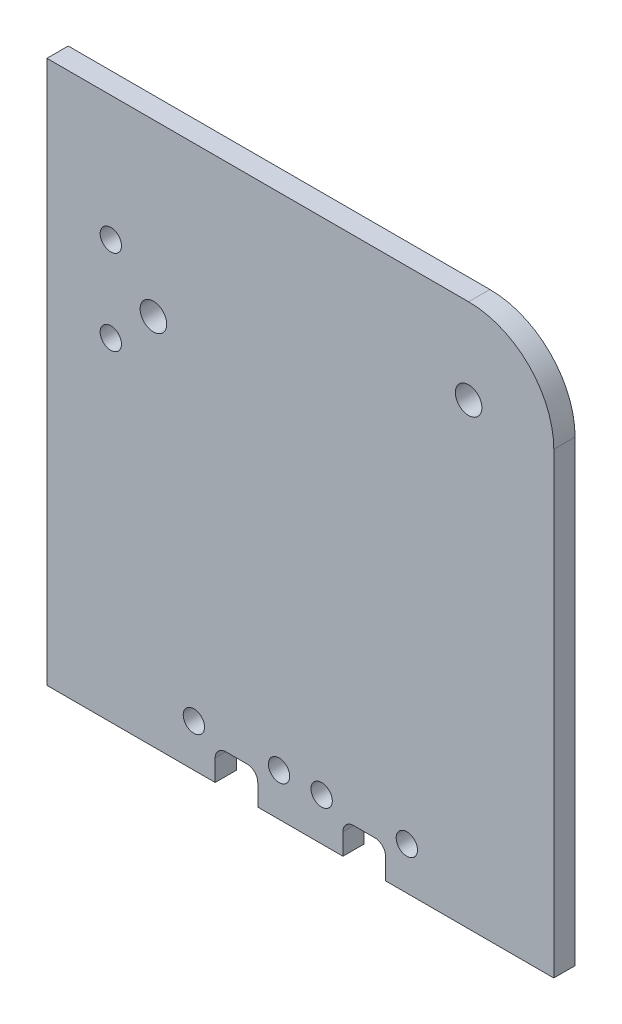
ISO-10303-21;
HEADER;
FILE_DESCRIPTION(('STEP AP214'),'2;1');
FILE_NAME('part.step','',(''),(''),'','','');
FILE_SCHEMA(('AUTOMOTIVE_DESIGN { 1 0 10303 214 1 1 1 1 }'));
ENDSEC;
DATA;
#1=APPLICATION_CONTEXT('core data for automotive mechanical design processes');
#2=APPLICATION_PROTOCOL_DEFINITION('international standard','automotive_design',2000,#1);
#3=PRODUCT_CONTEXT('',#1,'mechanical');
#4=PRODUCT('Part','Part','',(#3));
#5=PRODUCT_RELATED_PRODUCT_CATEGORY('part','',(#4));
#6=PRODUCT_DEFINITION_FORMATION('','',#4);
#7=PRODUCT_DEFINITION_CONTEXT('part definition',#1,'design');
#8=PRODUCT_DEFINITION('design','',#6,#7);
#9=PRODUCT_DEFINITION_SHAPE('','',#8);
#10=(LENGTH_UNIT() NAMED_UNIT(*) SI_UNIT(.MILLI.,.METRE.));
#11=(NAMED_UNIT(*) PLANE_ANGLE_UNIT() SI_UNIT($,.RADIAN.));
#12=(NAMED_UNIT(*) SI_UNIT($,.STERADIAN.) SOLID_ANGLE_UNIT());
#13=UNCERTAINTY_MEASURE_WITH_UNIT(LENGTH_MEASURE(1.E-05),#10,'distance_accuracy_value','');
#14=(GEOMETRIC_REPRESENTATION_CONTEXT(3) GLOBAL_UNCERTAINTY_ASSIGNED_CONTEXT((#13)) GLOBAL_UNIT_ASSIGNED_CONTEXT((#10,
#11,#12)) REPRESENTATION_CONTEXT('',''));
#15=CARTESIAN_POINT('',(0.,0.,0.));
#16=DIRECTION('',(0.,0.,1.));
#17=DIRECTION('',(1.,0.,0.));
#18=AXIS2_PLACEMENT_3D('',#15,#16,#17);
#19=CARTESIAN_POINT('',(11.0580949327945,-12.617994100295,2.));
#20=DIRECTION('',(0.,0.,1.));
#21=DIRECTION('',(1.,0.,0.));
#22=AXIS2_PLACEMENT_3D('',#19,#20,#21);
#23=PLANE('',#22);
#24=CARTESIAN_POINT('',(-2.74190506720548,-51.617994100295,2.));
#25=DIRECTION('',(0.,0.,1.));
#26=DIRECTION('',(1.,0.,0.));
#27=AXIS2_PLACEMENT_3D('',#24,#25,#26);
#28=CIRCLE('',#27,1.);
#29=CARTESIAN_POINT('',(-1.74190506720547,-51.617994100295,2.));
#30=VERTEX_POINT('',#29);
#31=EDGE_CURVE('E371',#30,#30,#28,.T.);
#32=ORIENTED_EDGE('',*,*,#31,.F.);
#33=EDGE_LOOP('',(#32));
#34=FACE_BOUND('',#33,.T.);
#35=CARTESIAN_POINT('',(-14.7419050672055,-51.617994100295,2.));
#36=DIRECTION('',(0.,0.,1.));
#37=DIRECTION('',(1.,0.,0.));
#38=AXIS2_PLACEMENT_3D('',#35,#36,#37);
#39=CIRCLE('',#38,1.);
#40=CARTESIAN_POINT('',(-13.7419050672055,-51.617994100295,2.));
#41=VERTEX_POINT('',#40);
#42=EDGE_CURVE('E383',#41,#41,#39,.T.);
#43=ORIENTED_EDGE('',*,*,#42,.F.);
#44=EDGE_LOOP('',(#43));
#45=FACE_BOUND('',#44,.T.);
#46=CARTESIAN_POINT('',(-22.5419050672055,-16.367994100295,2.));
#47=DIRECTION('',(0.,0.,1.));
#48=DIRECTION('',(1.,0.,0.));
#49=AXIS2_PLACEMENT_3D('',#46,#47,#48);
#50=CIRCLE('',#49,1.);
#51=CARTESIAN_POINT('',(-21.5419050672055,-16.367994100295,2.));
#52=VERTEX_POINT('',#51);
#53=EDGE_CURVE('E395',#52,#52,#50,.T.);
#54=ORIENTED_EDGE('',*,*,#53,.F.);
#55=EDGE_LOOP('',(#54));
#56=FACE_BOUND('',#55,.T.);
#57=CARTESIAN_POINT('',(11.0580949327945,-12.617994100295,2.));
#58=DIRECTION('',(0.,0.,1.));
#59=DIRECTION('',(1.,0.,0.));
#60=AXIS2_PLACEMENT_3D('',#57,#58,#59);
#61=CIRCLE('',#60,1.25);
#62=CARTESIAN_POINT('',(12.3080949327945,-12.617994100295,2.));
#63=VERTEX_POINT('',#62);
#64=EDGE_CURVE('E187',#63,#63,#61,.T.);
#65=ORIENTED_EDGE('',*,*,#64,.F.);
#66=EDGE_LOOP('',(#65));
#67=FACE_BOUND('',#66,.T.);
#68=DIRECTION('',(1.,0.,0.));
#69=VECTOR('',#68,1.);
#70=CARTESIAN_POINT('',(3.25809493279453,-55.617994100295,2.));
#71=LINE('',#70,#69);
#72=CARTESIAN_POINT('',(3.25809493279453,-55.617994100295,2.));
#73=VERTEX_POINT('',#72);
#74=CARTESIAN_POINT('',(19.0580949327945,-55.617994100295,2.));
#75=VERTEX_POINT('',#74);
#76=EDGE_CURVE('E218',#73,#75,#71,.T.);
#77=ORIENTED_EDGE('',*,*,#76,.T.);
#78=DIRECTION('',(0.,1.,0.));
#79=VECTOR('',#78,1.);
#80=CARTESIAN_POINT('',(19.0580949327945,-53.900810771949,2.));
#81=LINE('',#80,#79);
#82=CARTESIAN_POINT('',(19.0580949327945,-12.617994100295,2.));
#83=VERTEX_POINT('',#82);
#84=EDGE_CURVE('E119',#75,#83,#81,.T.);
#85=ORIENTED_EDGE('',*,*,#84,.T.);
#86=CARTESIAN_POINT('',(11.0580949327945,-12.617994100295,2.));
#87=DIRECTION('',(0.,0.,1.));
#88=DIRECTION('',(1.,0.,0.));
#89=AXIS2_PLACEMENT_3D('',#86,#87,#88);
#90=CIRCLE('',#89,8.);
#91=CARTESIAN_POINT('',(11.0580949327945,-4.61799410029498,2.));
#92=VERTEX_POINT('',#91);
#93=EDGE_CURVE('E260',#83,#92,#90,.T.);
#94=ORIENTED_EDGE('',*,*,#93,.T.);
#95=DIRECTION('',(-1.,0.,0.));
#96=VECTOR('',#95,1.);
#97=CARTESIAN_POINT('',(-27.5419050672055,-4.61799410029498,2.));
#98=LINE('',#97,#96);
#99=CARTESIAN_POINT('',(-28.5419050672055,-4.61799410029498,2.));
#100=VERTEX_POINT('',#99);
#101=EDGE_CURVE('E277',#92,#100,#98,.T.);
#102=ORIENTED_EDGE('',*,*,#101,.T.);
#103=DIRECTION('',(0.,-1.,0.));
#104=VECTOR('',#103,1.);
#105=CARTESIAN_POINT('',(-28.5419050672055,-4.61799410029498,2.));
#106=LINE('',#105,#104);
#107=CARTESIAN_POINT('',(-28.5419050672055,-55.617994100295,2.));
#108=VERTEX_POINT('',#107);
#109=EDGE_CURVE('E274',#100,#108,#106,.T.);
#110=ORIENTED_EDGE('',*,*,#109,.T.);
#111=DIRECTION('',(1.,0.,0.));
#112=VECTOR('',#111,1.);
#113=CARTESIAN_POINT('',(-28.5419050672055,-55.617994100295,2.));
#114=LINE('',#113,#112);
#115=CARTESIAN_POINT('',(-12.7419050672055,-55.617994100295,2.));
#116=VERTEX_POINT('',#115);
#117=EDGE_CURVE('E276',#108,#116,#114,.T.);
#118=ORIENTED_EDGE('',*,*,#117,.T.);
#119=DIRECTION('',(0.,1.,0.));
#120=VECTOR('',#119,1.);
#121=CARTESIAN_POINT('',(-12.7419050672055,-53.617994100295,2.));
#122=LINE('',#121,#120);
#123=CARTESIAN_POINT('',(-12.7419050672055,-53.617994100295,2.));
#124=VERTEX_POINT('',#123);
#125=EDGE_CURVE('E279',#116,#124,#122,.T.);
#126=ORIENTED_EDGE('',*,*,#125,.T.);
#127=CARTESIAN_POINT('',(-11.7419050672055,-53.617994100295,2.));
#128=DIRECTION('',(0.,0.,-1.));
#129=DIRECTION('',(-1.,0.,0.));
#130=AXIS2_PLACEMENT_3D('',#127,#128,#129);
#131=CIRCLE('',#130,1.);
#132=CARTESIAN_POINT('',(-11.7419050672055,-52.617994100295,2.));
#133=VERTEX_POINT('',#132);
#134=EDGE_CURVE('E285',#124,#133,#131,.T.);
#135=ORIENTED_EDGE('',*,*,#134,.T.);
#136=DIRECTION('',(1.,0.,0.));
#137=VECTOR('',#136,1.);
#138=CARTESIAN_POINT('',(-11.7419050672055,-52.617994100295,2.));
#139=LINE('',#138,#137);
#140=CARTESIAN_POINT('',(-9.74190506720548,-52.617994100295,2.));
#141=VERTEX_POINT('',#140);
#142=EDGE_CURVE('E287',#133,#141,#139,.T.);
#143=ORIENTED_EDGE('',*,*,#142,.T.);
#144=CARTESIAN_POINT('',(-9.74190506720548,-53.617994100295,2.));
#145=DIRECTION('',(0.,0.,-1.));
#146=DIRECTION('',(-1.,0.,0.));
#147=AXIS2_PLACEMENT_3D('',#144,#145,#146);
#148=CIRCLE('',#147,1.);
#149=CARTESIAN_POINT('',(-8.74190506720548,-53.617994100295,2.));
#150=VERTEX_POINT('',#149);
#151=EDGE_CURVE('E289',#141,#150,#148,.T.);
#152=ORIENTED_EDGE('',*,*,#151,.T.);
#153=DIRECTION('',(0.,-1.,0.));
#154=VECTOR('',#153,1.);
#155=CARTESIAN_POINT('',(-8.74190506720548,-53.617994100295,2.));
#156=LINE('',#155,#154);
#157=CARTESIAN_POINT('',(-8.74190506720548,-55.617994100295,2.));
#158=VERTEX_POINT('',#157);
#159=EDGE_CURVE('E291',#150,#158,#156,.T.);
#160=ORIENTED_EDGE('',*,*,#159,.T.);
#161=DIRECTION('',(1.,0.,0.));
#162=VECTOR('',#161,1.);
#163=CARTESIAN_POINT('',(-8.74190506720548,-55.617994100295,2.));
#164=LINE('',#163,#162);
#165=CARTESIAN_POINT('',(-0.741905067205475,-55.617994100295,2.));
#166=VERTEX_POINT('',#165);
#167=EDGE_CURVE('E293',#158,#166,#164,.T.);
#168=ORIENTED_EDGE('',*,*,#167,.T.);
#169=DIRECTION('',(0.,1.,0.));
#170=VECTOR('',#169,1.);
#171=CARTESIAN_POINT('',(-0.741905067205475,-53.617994100295,2.));
#172=LINE('',#171,#170);
#173=CARTESIAN_POINT('',(-0.741905067205475,-53.617994100295,2.));
#174=VERTEX_POINT('',#173);
#175=EDGE_CURVE('E295',#166,#174,#172,.T.);
#176=ORIENTED_EDGE('',*,*,#175,.T.);
#177=CARTESIAN_POINT('',(0.258094932794526,-53.617994100295,2.));
#178=DIRECTION('',(0.,0.,-1.));
#179=DIRECTION('',(-1.,0.,0.));
#180=AXIS2_PLACEMENT_3D('',#177,#178,#179);
#181=CIRCLE('',#180,1.);
#182=CARTESIAN_POINT('',(0.258094932794526,-52.617994100295,2.));
#183=VERTEX_POINT('',#182);
#184=EDGE_CURVE('E165',#174,#183,#181,.T.);
#185=ORIENTED_EDGE('',*,*,#184,.T.);
#186=DIRECTION('',(1.,0.,0.));
#187=VECTOR('',#186,1.);
#188=CARTESIAN_POINT('',(0.258094932794526,-52.617994100295,2.));
#189=LINE('',#188,#187);
#190=CARTESIAN_POINT('',(2.25809493279452,-52.617994100295,2.));
#191=VERTEX_POINT('',#190);
#192=EDGE_CURVE('E159',#183,#191,#189,.T.);
#193=ORIENTED_EDGE('',*,*,#192,.T.);
#194=CARTESIAN_POINT('',(2.25809493279452,-53.617994100295,2.));
#195=DIRECTION('',(0.,0.,-1.));
#196=DIRECTION('',(-1.,0.,0.));
#197=AXIS2_PLACEMENT_3D('',#194,#195,#196);
#198=CIRCLE('',#197,1.);
#199=CARTESIAN_POINT('',(3.25809493279453,-53.617994100295,2.));
#200=VERTEX_POINT('',#199);
#201=EDGE_CURVE('E163',#191,#200,#198,.T.);
#202=ORIENTED_EDGE('',*,*,#201,.T.);
#203=DIRECTION('',(0.,-1.,0.));
#204=VECTOR('',#203,1.);
#205=CARTESIAN_POINT('',(3.25809493279453,-53.617994100295,2.));
#206=LINE('',#205,#204);
#207=EDGE_CURVE('E49',#200,#73,#206,.T.);
#208=ORIENTED_EDGE('',*,*,#207,.T.);
#209=EDGE_LOOP('',(#77,#85,#94,#102,#110,#118,#126,#135,#143,#152,#160,#168,#176,#185,#193,#202,#208));
#210=FACE_BOUND('',#209,.T.);
#211=CARTESIAN_POINT('',(-18.5419050672055,-20.617994100295,2.));
#212=DIRECTION('',(0.,0.,1.));
#213=DIRECTION('',(1.,0.,0.));
#214=AXIS2_PLACEMENT_3D('',#211,#212,#213);
#215=CIRCLE('',#214,1.25);
#216=CARTESIAN_POINT('',(-17.2919050672055,-20.617994100295,2.));
#217=VERTEX_POINT('',#216);
#218=EDGE_CURVE('E401',#217,#217,#215,.T.);
#219=ORIENTED_EDGE('',*,*,#218,.F.);
#220=EDGE_LOOP('',(#219));
#221=FACE_BOUND('',#220,.T.);
#222=CARTESIAN_POINT('',(-22.5419050672055,-24.367994100295,2.));
#223=DIRECTION('',(0.,0.,1.));
#224=DIRECTION('',(1.,0.,0.));
#225=AXIS2_PLACEMENT_3D('',#222,#223,#224);
#226=CIRCLE('',#225,1.);
#227=CARTESIAN_POINT('',(-21.5419050672055,-24.367994100295,2.));
#228=VERTEX_POINT('',#227);
#229=EDGE_CURVE('E389',#228,#228,#226,.T.);
#230=ORIENTED_EDGE('',*,*,#229,.F.);
#231=EDGE_LOOP('',(#230));
#232=FACE_BOUND('',#231,.T.);
#233=CARTESIAN_POINT('',(-6.74190506720547,-51.617994100295,2.));
#234=DIRECTION('',(0.,0.,1.));
#235=DIRECTION('',(1.,0.,0.));
#236=AXIS2_PLACEMENT_3D('',#233,#234,#235);
#237=CIRCLE('',#236,1.);
#238=CARTESIAN_POINT('',(-5.74190506720547,-51.617994100295,2.));
#239=VERTEX_POINT('',#238);
#240=EDGE_CURVE('E377',#239,#239,#237,.T.);
#241=ORIENTED_EDGE('',*,*,#240,.F.);
#242=EDGE_LOOP('',(#241));
#243=FACE_BOUND('',#242,.T.);
#244=CARTESIAN_POINT('',(5.25809493279453,-51.617994100295,2.));
#245=DIRECTION('',(0.,0.,1.));
#246=DIRECTION('',(1.,0.,0.));
#247=AXIS2_PLACEMENT_3D('',#244,#245,#246);
#248=CIRCLE('',#247,1.);
#249=CARTESIAN_POINT('',(6.25809493279453,-51.617994100295,2.));
#250=VERTEX_POINT('',#249);
#251=EDGE_CURVE('E362',#250,#250,#248,.T.);
#252=ORIENTED_EDGE('',*,*,#251,.F.);
#253=EDGE_LOOP('',(#252));
#254=FACE_BOUND('',#253,.T.);
#255=ADVANCED_FACE('F32',(#34,#45,#56,#67,#210,#221,#232,#243,#254),#23,.T.);
#256=CARTESIAN_POINT('',(11.0580949327945,-12.617994100295,0.));
#257=DIRECTION('',(0.,0.,1.));
#258=DIRECTION('',(1.,0.,0.));
#259=AXIS2_PLACEMENT_3D('',#256,#257,#258);
#260=PLANE('',#259);
#261=DIRECTION('',(1.,0.,0.));
#262=VECTOR('',#261,1.);
#263=CARTESIAN_POINT('',(3.25809493279453,-55.617994100295,0.));
#264=LINE('',#263,#262);
#265=CARTESIAN_POINT('',(3.25809493279453,-55.617994100295,0.));
#266=VERTEX_POINT('',#265);
#267=CARTESIAN_POINT('',(19.0580949327945,-55.617994100295,0.));
#268=VERTEX_POINT('',#267);
#269=EDGE_CURVE('E183',#266,#268,#264,.T.);
#270=ORIENTED_EDGE('',*,*,#269,.F.);
#271=DIRECTION('',(0.,-1.,0.));
#272=VECTOR('',#271,1.);
#273=CARTESIAN_POINT('',(3.25809493279453,-53.617994100295,0.));
#274=LINE('',#273,#272);
#275=CARTESIAN_POINT('',(3.25809493279453,-53.617994100295,0.));
#276=VERTEX_POINT('',#275);
#277=EDGE_CURVE('E111',#276,#266,#274,.T.);
#278=ORIENTED_EDGE('',*,*,#277,.F.);
#279=CARTESIAN_POINT('',(2.25809493279452,-53.617994100295,0.));
#280=DIRECTION('',(0.,0.,-1.));
#281=DIRECTION('',(-1.,0.,0.));
#282=AXIS2_PLACEMENT_3D('',#279,#280,#281);
#283=CIRCLE('',#282,1.);
#284=CARTESIAN_POINT('',(2.25809493279452,-52.617994100295,0.));
#285=VERTEX_POINT('',#284);
#286=EDGE_CURVE('E105',#285,#276,#283,.T.);
#287=ORIENTED_EDGE('',*,*,#286,.F.);
#288=DIRECTION('',(1.,0.,0.));
#289=VECTOR('',#288,1.);
#290=CARTESIAN_POINT('',(0.258094932794526,-52.617994100295,0.));
#291=LINE('',#290,#289);
#292=CARTESIAN_POINT('',(0.258094932794526,-52.617994100295,0.));
#293=VERTEX_POINT('',#292);
#294=EDGE_CURVE('E173',#293,#285,#291,.T.);
#295=ORIENTED_EDGE('',*,*,#294,.F.);
#296=CARTESIAN_POINT('',(0.258094932794526,-53.617994100295,0.));
#297=DIRECTION('',(0.,0.,-1.));
#298=DIRECTION('',(-1.,0.,0.));
#299=AXIS2_PLACEMENT_3D('',#296,#297,#298);
#300=CIRCLE('',#299,1.);
#301=CARTESIAN_POINT('',(-0.741905067205475,-53.617994100295,0.));
#302=VERTEX_POINT('',#301);
#303=EDGE_CURVE('E213',#302,#293,#300,.T.);
#304=ORIENTED_EDGE('',*,*,#303,.F.);
#305=DIRECTION('',(0.,1.,0.));
#306=VECTOR('',#305,1.);
#307=CARTESIAN_POINT('',(-0.741905067205475,-53.617994100295,0.));
#308=LINE('',#307,#306);
#309=CARTESIAN_POINT('',(-0.741905067205475,-55.617994100295,0.));
#310=VERTEX_POINT('',#309);
#311=EDGE_CURVE('E211',#310,#302,#308,.T.);
#312=ORIENTED_EDGE('',*,*,#311,.F.);
#313=DIRECTION('',(1.,0.,0.));
#314=VECTOR('',#313,1.);
#315=CARTESIAN_POINT('',(-8.74190506720548,-55.617994100295,0.));
#316=LINE('',#315,#314);
#317=CARTESIAN_POINT('',(-8.74190506720548,-55.617994100295,0.));
#318=VERTEX_POINT('',#317);
#319=EDGE_CURVE('E209',#318,#310,#316,.T.);
#320=ORIENTED_EDGE('',*,*,#319,.F.);
#321=DIRECTION('',(0.,-1.,0.));
#322=VECTOR('',#321,1.);
#323=CARTESIAN_POINT('',(-8.74190506720548,-53.617994100295,0.));
#324=LINE('',#323,#322);
#325=CARTESIAN_POINT('',(-8.74190506720548,-53.617994100295,0.));
#326=VERTEX_POINT('',#325);
#327=EDGE_CURVE('E207',#326,#318,#324,.T.);
#328=ORIENTED_EDGE('',*,*,#327,.F.);
#329=CARTESIAN_POINT('',(-9.74190506720548,-53.617994100295,0.));
#330=DIRECTION('',(0.,0.,-1.));
#331=DIRECTION('',(-1.,0.,0.));
#332=AXIS2_PLACEMENT_3D('',#329,#330,#331);
#333=CIRCLE('',#332,1.);
#334=CARTESIAN_POINT('',(-9.74190506720548,-52.617994100295,0.));
#335=VERTEX_POINT('',#334);
#336=EDGE_CURVE('E205',#335,#326,#333,.T.);
#337=ORIENTED_EDGE('',*,*,#336,.F.);
#338=DIRECTION('',(1.,0.,0.));
#339=VECTOR('',#338,1.);
#340=CARTESIAN_POINT('',(-11.7419050672055,-52.617994100295,0.));
#341=LINE('',#340,#339);
#342=CARTESIAN_POINT('',(-11.7419050672055,-52.617994100295,0.));
#343=VERTEX_POINT('',#342);
#344=EDGE_CURVE('E203',#343,#335,#341,.T.);
#345=ORIENTED_EDGE('',*,*,#344,.F.);
#346=CARTESIAN_POINT('',(-11.7419050672055,-53.617994100295,0.));
#347=DIRECTION('',(0.,0.,-1.));
#348=DIRECTION('',(-1.,0.,0.));
#349=AXIS2_PLACEMENT_3D('',#346,#347,#348);
#350=CIRCLE('',#349,1.);
#351=CARTESIAN_POINT('',(-12.7419050672055,-53.617994100295,0.));
#352=VERTEX_POINT('',#351);
#353=EDGE_CURVE('E201',#352,#343,#350,.T.);
#354=ORIENTED_EDGE('',*,*,#353,.F.);
#355=DIRECTION('',(0.,1.,0.));
#356=VECTOR('',#355,1.);
#357=CARTESIAN_POINT('',(-12.7419050672055,-53.617994100295,0.));
#358=LINE('',#357,#356);
#359=CARTESIAN_POINT('',(-12.7419050672055,-55.617994100295,0.));
#360=VERTEX_POINT('',#359);
#361=EDGE_CURVE('E199',#360,#352,#358,.T.);
#362=ORIENTED_EDGE('',*,*,#361,.F.);
#363=DIRECTION('',(1.,0.,0.));
#364=VECTOR('',#363,1.);
#365=CARTESIAN_POINT('',(-28.5419050672055,-55.617994100295,0.));
#366=LINE('',#365,#364);
#367=CARTESIAN_POINT('',(-28.5419050672055,-55.617994100295,0.));
#368=VERTEX_POINT('',#367);
#369=EDGE_CURVE('E197',#368,#360,#366,.T.);
#370=ORIENTED_EDGE('',*,*,#369,.F.);
#371=DIRECTION('',(0.,-1.,0.));
#372=VECTOR('',#371,1.);
#373=CARTESIAN_POINT('',(-28.5419050672055,-53.617994100295,0.));
#374=LINE('',#373,#372);
#375=CARTESIAN_POINT('',(-28.5419050672055,-4.61799410029498,0.));
#376=VERTEX_POINT('',#375);
#377=EDGE_CURVE('E195',#376,#368,#374,.T.);
#378=ORIENTED_EDGE('',*,*,#377,.F.);
#379=DIRECTION('',(-1.,0.,0.));
#380=VECTOR('',#379,1.);
#381=CARTESIAN_POINT('',(-27.5419050672055,-4.61799410029498,0.));
#382=LINE('',#381,#380);
#383=CARTESIAN_POINT('',(11.0580949327945,-4.61799410029498,0.));
#384=VERTEX_POINT('',#383);
#385=EDGE_CURVE('E192',#384,#376,#382,.T.);
#386=ORIENTED_EDGE('',*,*,#385,.F.);
#387=CARTESIAN_POINT('',(11.0580949327945,-12.617994100295,0.));
#388=DIRECTION('',(0.,0.,1.));
#389=DIRECTION('',(1.,0.,0.));
#390=AXIS2_PLACEMENT_3D('',#387,#388,#389);
#391=CIRCLE('',#390,8.);
#392=CARTESIAN_POINT('',(19.0580949327945,-12.617994100295,0.));
#393=VERTEX_POINT('',#392);
#394=EDGE_CURVE('E189',#393,#384,#391,.T.);
#395=ORIENTED_EDGE('',*,*,#394,.F.);
#396=DIRECTION('',(0.,1.,0.));
#397=VECTOR('',#396,1.);
#398=CARTESIAN_POINT('',(19.0580949327945,-12.617994100295,0.));
#399=LINE('',#398,#397);
#400=EDGE_CURVE('E186',#268,#393,#399,.T.);
#401=ORIENTED_EDGE('',*,*,#400,.F.);
#402=EDGE_LOOP('',(#270,#278,#287,#295,#304,#312,#320,#328,#337,#345,#354,#362,#370,#378,#386,
#395,#401));
#403=FACE_BOUND('',#402,.T.);
#404=CARTESIAN_POINT('',(11.0580949327945,-12.617994100295,0.));
#405=DIRECTION('',(0.,0.,1.));
#406=DIRECTION('',(1.,0.,0.));
#407=AXIS2_PLACEMENT_3D('',#404,#405,#406);
#408=CIRCLE('',#407,1.25);
#409=CARTESIAN_POINT('',(12.3080949327945,-12.617994100295,0.));
#410=VERTEX_POINT('',#409);
#411=EDGE_CURVE('E404',#410,#410,#408,.T.);
#412=ORIENTED_EDGE('',*,*,#411,.T.);
#413=EDGE_LOOP('',(#412));
#414=FACE_BOUND('',#413,.T.);
#415=CARTESIAN_POINT('',(-18.5419050672055,-20.617994100295,0.));
#416=DIRECTION('',(0.,0.,1.));
#417=DIRECTION('',(1.,0.,0.));
#418=AXIS2_PLACEMENT_3D('',#415,#416,#417);
#419=CIRCLE('',#418,1.25);
#420=CARTESIAN_POINT('',(-17.2919050672055,-20.617994100295,0.));
#421=VERTEX_POINT('',#420);
#422=EDGE_CURVE('E398',#421,#421,#419,.T.);
#423=ORIENTED_EDGE('',*,*,#422,.T.);
#424=EDGE_LOOP('',(#423));
#425=FACE_BOUND('',#424,.T.);
#426=CARTESIAN_POINT('',(-22.5419050672055,-16.367994100295,0.));
#427=DIRECTION('',(0.,0.,1.));
#428=DIRECTION('',(1.,0.,0.));
#429=AXIS2_PLACEMENT_3D('',#426,#427,#428);
#430=CIRCLE('',#429,1.);
#431=CARTESIAN_POINT('',(-21.5419050672055,-16.367994100295,0.));
#432=VERTEX_POINT('',#431);
#433=EDGE_CURVE('E392',#432,#432,#430,.T.);
#434=ORIENTED_EDGE('',*,*,#433,.T.);
#435=EDGE_LOOP('',(#434));
#436=FACE_BOUND('',#435,.T.);
#437=CARTESIAN_POINT('',(-22.5419050672055,-24.367994100295,0.));
#438=DIRECTION('',(0.,0.,1.));
#439=DIRECTION('',(1.,0.,0.));
#440=AXIS2_PLACEMENT_3D('',#437,#438,#439);
#441=CIRCLE('',#440,1.);
#442=CARTESIAN_POINT('',(-21.5419050672055,-24.367994100295,0.));
#443=VERTEX_POINT('',#442);
#444=EDGE_CURVE('E386',#443,#443,#441,.T.);
#445=ORIENTED_EDGE('',*,*,#444,.T.);
#446=EDGE_LOOP('',(#445));
#447=FACE_BOUND('',#446,.T.);
#448=CARTESIAN_POINT('',(-14.7419050672055,-51.617994100295,0.));
#449=DIRECTION('',(0.,0.,1.));
#450=DIRECTION('',(1.,0.,0.));
#451=AXIS2_PLACEMENT_3D('',#448,#449,#450);
#452=CIRCLE('',#451,1.);
#453=CARTESIAN_POINT('',(-13.7419050672055,-51.617994100295,0.));
#454=VERTEX_POINT('',#453);
#455=EDGE_CURVE('E380',#454,#454,#452,.T.);
#456=ORIENTED_EDGE('',*,*,#455,.T.);
#457=EDGE_LOOP('',(#456));
#458=FACE_BOUND('',#457,.T.);
#459=CARTESIAN_POINT('',(-6.74190506720547,-51.617994100295,0.));
#460=DIRECTION('',(0.,0.,1.));
#461=DIRECTION('',(1.,0.,0.));
#462=AXIS2_PLACEMENT_3D('',#459,#460,#461);
#463=CIRCLE('',#462,1.);
#464=CARTESIAN_POINT('',(-5.74190506720547,-51.617994100295,0.));
#465=VERTEX_POINT('',#464);
#466=EDGE_CURVE('E374',#465,#465,#463,.T.);
#467=ORIENTED_EDGE('',*,*,#466,.T.);
#468=EDGE_LOOP('',(#467));
#469=FACE_BOUND('',#468,.T.);
#470=CARTESIAN_POINT('',(-2.74190506720548,-51.617994100295,0.));
#471=DIRECTION('',(0.,0.,1.));
#472=DIRECTION('',(1.,0.,0.));
#473=AXIS2_PLACEMENT_3D('',#470,#471,#472);
#474=CIRCLE('',#473,1.);
#475=CARTESIAN_POINT('',(-1.74190506720547,-51.617994100295,0.));
#476=VERTEX_POINT('',#475);
#477=EDGE_CURVE('E368',#476,#476,#474,.T.);
#478=ORIENTED_EDGE('',*,*,#477,.T.);
#479=EDGE_LOOP('',(#478));
#480=FACE_BOUND('',#479,.T.);
#481=CARTESIAN_POINT('',(5.25809493279453,-51.617994100295,0.));
#482=DIRECTION('',(0.,0.,1.));
#483=DIRECTION('',(1.,0.,0.));
#484=AXIS2_PLACEMENT_3D('',#481,#482,#483);
#485=CIRCLE('',#484,1.);
#486=CARTESIAN_POINT('',(6.25809493279453,-51.617994100295,0.));
#487=VERTEX_POINT('',#486);
#488=EDGE_CURVE('E365',#487,#487,#485,.T.);
#489=ORIENTED_EDGE('',*,*,#488,.T.);
#490=EDGE_LOOP('',(#489));
#491=FACE_BOUND('',#490,.T.);
#492=ADVANCED_FACE('F263',(#403,#414,#425,#436,#447,#458,#469,#480,#491),#260,.F.);
#493=CARTESIAN_POINT('',(3.25809493279453,-55.617994100295,2.));
#494=DIRECTION('',(0.,1.,0.));
#495=DIRECTION('',(-1.,0.,0.));
#496=AXIS2_PLACEMENT_3D('',#493,#494,#495);
#497=PLANE('',#496);
#498=ORIENTED_EDGE('',*,*,#269,.T.);
#499=DIRECTION('',(0.,0.,-1.));
#500=VECTOR('',#499,1.);
#501=CARTESIAN_POINT('',(19.0580949327945,-55.617994100295,2.));
#502=LINE('',#501,#500);
#503=EDGE_CURVE('E11',#75,#268,#502,.T.);
#504=ORIENTED_EDGE('',*,*,#503,.F.);
#505=ORIENTED_EDGE('',*,*,#76,.F.);
#506=DIRECTION('',(0.,0.,-1.));
#507=VECTOR('',#506,1.);
#508=CARTESIAN_POINT('',(3.25809493279453,-55.617994100295,2.));
#509=LINE('',#508,#507);
#510=EDGE_CURVE('E179',#73,#266,#509,.T.);
#511=ORIENTED_EDGE('',*,*,#510,.T.);
#512=EDGE_LOOP('',(#498,#504,#505,#511));
#513=FACE_BOUND('',#512,.T.);
#514=ADVANCED_FACE('F34',(#513),#497,.F.);
#515=CARTESIAN_POINT('',(19.0580949327945,-12.617994100295,2.));
#516=DIRECTION('',(-1.,0.,0.));
#517=DIRECTION('',(0.,-1.,0.));
#518=AXIS2_PLACEMENT_3D('',#515,#516,#517);
#519=PLANE('',#518);
#520=ORIENTED_EDGE('',*,*,#400,.T.);
#521=DIRECTION('',(0.,0.,-1.));
#522=VECTOR('',#521,1.);
#523=CARTESIAN_POINT('',(19.0580949327945,-12.617994100295,2.));
#524=LINE('',#523,#522);
#525=EDGE_CURVE('E41',#83,#393,#524,.T.);
#526=ORIENTED_EDGE('',*,*,#525,.F.);
#527=ORIENTED_EDGE('',*,*,#84,.F.);
#528=ORIENTED_EDGE('',*,*,#503,.T.);
#529=EDGE_LOOP('',(#520,#526,#527,#528));
#530=FACE_BOUND('',#529,.T.);
#531=ADVANCED_FACE('F603',(#530),#519,.F.);
#532=CARTESIAN_POINT('',(11.0580949327945,-12.617994100295,2.));
#533=DIRECTION('',(0.,0.,-1.));
#534=DIRECTION('',(-1.,0.,0.));
#535=AXIS2_PLACEMENT_3D('',#532,#533,#534);
#536=CYLINDRICAL_SURFACE('',#535,8.);
#537=ORIENTED_EDGE('',*,*,#394,.T.);
#538=DIRECTION('',(0.,0.,-1.));
#539=VECTOR('',#538,1.);
#540=CARTESIAN_POINT('',(11.0580949327945,-4.61799410029498,2.));
#541=LINE('',#540,#539);
#542=EDGE_CURVE('E252',#92,#384,#541,.T.);
#543=ORIENTED_EDGE('',*,*,#542,.F.);
#544=ORIENTED_EDGE('',*,*,#93,.F.);
#545=ORIENTED_EDGE('',*,*,#525,.T.);
#546=EDGE_LOOP('',(#537,#543,#544,#545));
#547=FACE_BOUND('',#546,.T.);
#548=ADVANCED_FACE('F258',(#547),#536,.T.);
#549=CARTESIAN_POINT('',(-27.5419050672055,-4.61799410029498,2.));
#550=DIRECTION('',(0.,-1.,0.));
#551=DIRECTION('',(0.,0.,-1.));
#552=AXIS2_PLACEMENT_3D('',#549,#550,#551);
#553=PLANE('',#552);
#554=ORIENTED_EDGE('',*,*,#385,.T.);
#555=DIRECTION('',(0.,0.,-1.));
#556=VECTOR('',#555,1.);
#557=CARTESIAN_POINT('',(-28.5419050672055,-4.61799410029498,2.));
#558=LINE('',#557,#556);
#559=EDGE_CURVE('E249',#100,#376,#558,.T.);
#560=ORIENTED_EDGE('',*,*,#559,.F.);
#561=ORIENTED_EDGE('',*,*,#101,.F.);
#562=ORIENTED_EDGE('',*,*,#542,.T.);
#563=EDGE_LOOP('',(#554,#560,#561,#562));
#564=FACE_BOUND('',#563,.T.);
#565=ADVANCED_FACE('F268',(#564),#553,.F.);
#566=CARTESIAN_POINT('',(-28.5419050672055,-53.617994100295,2.));
#567=DIRECTION('',(1.,0.,0.));
#568=DIRECTION('',(0.,0.,-1.));
#569=AXIS2_PLACEMENT_3D('',#566,#567,#568);
#570=PLANE('',#569);
#571=ORIENTED_EDGE('',*,*,#377,.T.);
#572=DIRECTION('',(0.,0.,-1.));
#573=VECTOR('',#572,1.);
#574=CARTESIAN_POINT('',(-28.5419050672055,-55.617994100295,2.));
#575=LINE('',#574,#573);
#576=EDGE_CURVE('E246',#108,#368,#575,.T.);
#577=ORIENTED_EDGE('',*,*,#576,.F.);
#578=ORIENTED_EDGE('',*,*,#109,.F.);
#579=ORIENTED_EDGE('',*,*,#559,.T.);
#580=EDGE_LOOP('',(#571,#577,#578,#579));
#581=FACE_BOUND('',#580,.T.);
#582=ADVANCED_FACE('F272',(#581),#570,.F.);
#583=CARTESIAN_POINT('',(-28.5419050672055,-55.617994100295,2.));
#584=DIRECTION('',(0.,1.,0.));
#585=DIRECTION('',(0.,0.,1.));
#586=AXIS2_PLACEMENT_3D('',#583,#584,#585);
#587=PLANE('',#586);
#588=ORIENTED_EDGE('',*,*,#369,.T.);
#589=DIRECTION('',(0.,0.,-1.));
#590=VECTOR('',#589,1.);
#591=CARTESIAN_POINT('',(-12.7419050672055,-55.617994100295,2.));
#592=LINE('',#591,#590);
#593=EDGE_CURVE('E243',#116,#360,#592,.T.);
#594=ORIENTED_EDGE('',*,*,#593,.F.);
#595=ORIENTED_EDGE('',*,*,#117,.F.);
#596=ORIENTED_EDGE('',*,*,#576,.T.);
#597=EDGE_LOOP('',(#588,#594,#595,#596));
#598=FACE_BOUND('',#597,.T.);
#599=ADVANCED_FACE('F565',(#598),#587,.F.);
#600=CARTESIAN_POINT('',(-12.7419050672055,-53.617994100295,2.));
#601=DIRECTION('',(-1.,0.,0.));
#602=DIRECTION('',(0.,0.,1.));
#603=AXIS2_PLACEMENT_3D('',#600,#601,#602);
#604=PLANE('',#603);
#605=ORIENTED_EDGE('',*,*,#361,.T.);
#606=DIRECTION('',(0.,0.,-1.));
#607=VECTOR('',#606,1.);
#608=CARTESIAN_POINT('',(-12.7419050672055,-53.617994100295,2.));
#609=LINE('',#608,#607);
#610=EDGE_CURVE('E240',#124,#352,#609,.T.);
#611=ORIENTED_EDGE('',*,*,#610,.F.);
#612=ORIENTED_EDGE('',*,*,#125,.F.);
#613=ORIENTED_EDGE('',*,*,#593,.T.);
#614=EDGE_LOOP('',(#605,#611,#612,#613));
#615=FACE_BOUND('',#614,.T.);
#616=ADVANCED_FACE('F555',(#615),#604,.F.);
#617=CARTESIAN_POINT('',(-11.7419050672055,-53.617994100295,2.));
#618=DIRECTION('',(0.,0.,-1.));
#619=DIRECTION('',(-1.,0.,0.));
#620=AXIS2_PLACEMENT_3D('',#617,#618,#619);
#621=CYLINDRICAL_SURFACE('',#620,1.);
#622=ORIENTED_EDGE('',*,*,#353,.T.);
#623=DIRECTION('',(0.,0.,-1.));
#624=VECTOR('',#623,1.);
#625=CARTESIAN_POINT('',(-11.7419050672055,-52.617994100295,2.));
#626=LINE('',#625,#624);
#627=EDGE_CURVE('E237',#133,#343,#626,.T.);
#628=ORIENTED_EDGE('',*,*,#627,.F.);
#629=ORIENTED_EDGE('',*,*,#134,.F.);
#630=ORIENTED_EDGE('',*,*,#610,.T.);
#631=EDGE_LOOP('',(#622,#628,#629,#630));
#632=FACE_BOUND('',#631,.T.);
#633=ADVANCED_FACE('F545',(#632),#621,.F.);
#634=CARTESIAN_POINT('',(-11.7419050672055,-52.617994100295,2.));
#635=DIRECTION('',(0.,1.,0.));
#636=DIRECTION('',(-1.,0.,0.));
#637=AXIS2_PLACEMENT_3D('',#634,#635,#636);
#638=PLANE('',#637);
#639=ORIENTED_EDGE('',*,*,#344,.T.);
#640=DIRECTION('',(0.,0.,-1.));
#641=VECTOR('',#640,1.);
#642=CARTESIAN_POINT('',(-9.74190506720548,-52.617994100295,2.));
#643=LINE('',#642,#641);
#644=EDGE_CURVE('E234',#141,#335,#643,.T.);
#645=ORIENTED_EDGE('',*,*,#644,.F.);
#646=ORIENTED_EDGE('',*,*,#142,.F.);
#647=ORIENTED_EDGE('',*,*,#627,.T.);
#648=EDGE_LOOP('',(#639,#645,#646,#647));
#649=FACE_BOUND('',#648,.T.);
#650=ADVANCED_FACE('F535',(#649),#638,.F.);
#651=CARTESIAN_POINT('',(-9.74190506720548,-53.617994100295,2.));
#652=DIRECTION('',(0.,0.,-1.));
#653=DIRECTION('',(-1.,0.,0.));
#654=AXIS2_PLACEMENT_3D('',#651,#652,#653);
#655=CYLINDRICAL_SURFACE('',#654,1.);
#656=ORIENTED_EDGE('',*,*,#336,.T.);
#657=DIRECTION('',(0.,0.,-1.));
#658=VECTOR('',#657,1.);
#659=CARTESIAN_POINT('',(-8.74190506720548,-53.617994100295,2.));
#660=LINE('',#659,#658);
#661=EDGE_CURVE('E231',#150,#326,#660,.T.);
#662=ORIENTED_EDGE('',*,*,#661,.F.);
#663=ORIENTED_EDGE('',*,*,#151,.F.);
#664=ORIENTED_EDGE('',*,*,#644,.T.);
#665=EDGE_LOOP('',(#656,#662,#663,#664));
#666=FACE_BOUND('',#665,.T.);
#667=ADVANCED_FACE('F525',(#666),#655,.F.);
#668=CARTESIAN_POINT('',(-8.74190506720548,-53.617994100295,2.));
#669=DIRECTION('',(1.,0.,0.));
#670=DIRECTION('',(0.,0.,-1.));
#671=AXIS2_PLACEMENT_3D('',#668,#669,#670);
#672=PLANE('',#671);
#673=ORIENTED_EDGE('',*,*,#327,.T.);
#674=DIRECTION('',(0.,0.,-1.));
#675=VECTOR('',#674,1.);
#676=CARTESIAN_POINT('',(-8.74190506720548,-55.617994100295,2.));
#677=LINE('',#676,#675);
#678=EDGE_CURVE('E228',#158,#318,#677,.T.);
#679=ORIENTED_EDGE('',*,*,#678,.F.);
#680=ORIENTED_EDGE('',*,*,#159,.F.);
#681=ORIENTED_EDGE('',*,*,#661,.T.);
#682=EDGE_LOOP('',(#673,#679,#680,#681));
#683=FACE_BOUND('',#682,.T.);
#684=ADVANCED_FACE('F515',(#683),#672,.F.);
#685=CARTESIAN_POINT('',(-8.74190506720548,-55.617994100295,2.));
#686=DIRECTION('',(0.,1.,0.));
#687=DIRECTION('',(0.,0.,1.));
#688=AXIS2_PLACEMENT_3D('',#685,#686,#687);
#689=PLANE('',#688);
#690=ORIENTED_EDGE('',*,*,#319,.T.);
#691=DIRECTION('',(0.,0.,-1.));
#692=VECTOR('',#691,1.);
#693=CARTESIAN_POINT('',(-0.741905067205475,-55.617994100295,2.));
#694=LINE('',#693,#692);
#695=EDGE_CURVE('E225',#166,#310,#694,.T.);
#696=ORIENTED_EDGE('',*,*,#695,.F.);
#697=ORIENTED_EDGE('',*,*,#167,.F.);
#698=ORIENTED_EDGE('',*,*,#678,.T.);
#699=EDGE_LOOP('',(#690,#696,#697,#698));
#700=FACE_BOUND('',#699,.T.);
#701=ADVANCED_FACE('F506',(#700),#689,.F.);
#702=CARTESIAN_POINT('',(-0.741905067205475,-53.617994100295,2.));
#703=DIRECTION('',(-1.,0.,0.));
#704=DIRECTION('',(0.,0.,1.));
#705=AXIS2_PLACEMENT_3D('',#702,#703,#704);
#706=PLANE('',#705);
#707=ORIENTED_EDGE('',*,*,#311,.T.);
#708=DIRECTION('',(0.,0.,-1.));
#709=VECTOR('',#708,1.);
#710=CARTESIAN_POINT('',(-0.741905067205475,-53.617994100295,2.));
#711=LINE('',#710,#709);
#712=EDGE_CURVE('E222',#174,#302,#711,.T.);
#713=ORIENTED_EDGE('',*,*,#712,.F.);
#714=ORIENTED_EDGE('',*,*,#175,.F.);
#715=ORIENTED_EDGE('',*,*,#695,.T.);
#716=EDGE_LOOP('',(#707,#713,#714,#715));
#717=FACE_BOUND('',#716,.T.);
#718=ADVANCED_FACE('F301',(#717),#706,.F.);
#719=CARTESIAN_POINT('',(0.258094932794526,-53.617994100295,2.));
#720=DIRECTION('',(0.,0.,-1.));
#721=DIRECTION('',(-1.,0.,0.));
#722=AXIS2_PLACEMENT_3D('',#719,#720,#721);
#723=CYLINDRICAL_SURFACE('',#722,1.);
#724=ORIENTED_EDGE('',*,*,#303,.T.);
#725=DIRECTION('',(0.,0.,-1.));
#726=VECTOR('',#725,1.);
#727=CARTESIAN_POINT('',(0.258094932794526,-52.617994100295,2.));
#728=LINE('',#727,#726);
#729=EDGE_CURVE('E174',#183,#293,#728,.T.);
#730=ORIENTED_EDGE('',*,*,#729,.F.);
#731=ORIENTED_EDGE('',*,*,#184,.F.);
#732=ORIENTED_EDGE('',*,*,#712,.T.);
#733=EDGE_LOOP('',(#724,#730,#731,#732));
#734=FACE_BOUND('',#733,.T.);
#735=ADVANCED_FACE('F305',(#734),#723,.F.);
#736=CARTESIAN_POINT('',(0.258094932794526,-52.617994100295,2.));
#737=DIRECTION('',(0.,1.,0.));
#738=DIRECTION('',(0.,0.,1.));
#739=AXIS2_PLACEMENT_3D('',#736,#737,#738);
#740=PLANE('',#739);
#741=ORIENTED_EDGE('',*,*,#294,.T.);
#742=DIRECTION('',(0.,0.,-1.));
#743=VECTOR('',#742,1.);
#744=CARTESIAN_POINT('',(2.25809493279452,-52.617994100295,2.));
#745=LINE('',#744,#743);
#746=EDGE_CURVE('E170',#191,#285,#745,.T.);
#747=ORIENTED_EDGE('',*,*,#746,.F.);
#748=ORIENTED_EDGE('',*,*,#192,.F.);
#749=ORIENTED_EDGE('',*,*,#729,.T.);
#750=EDGE_LOOP('',(#741,#747,#748,#749));
#751=FACE_BOUND('',#750,.T.);
#752=ADVANCED_FACE('F171',(#751),#740,.F.);
#753=CARTESIAN_POINT('',(2.25809493279452,-53.617994100295,2.));
#754=DIRECTION('',(0.,0.,-1.));
#755=DIRECTION('',(-1.,0.,0.));
#756=AXIS2_PLACEMENT_3D('',#753,#754,#755);
#757=CYLINDRICAL_SURFACE('',#756,1.);
#758=ORIENTED_EDGE('',*,*,#286,.T.);
#759=DIRECTION('',(0.,0.,-1.));
#760=VECTOR('',#759,1.);
#761=CARTESIAN_POINT('',(3.25809493279453,-53.617994100295,2.));
#762=LINE('',#761,#760);
#763=EDGE_CURVE('E175',#200,#276,#762,.T.);
#764=ORIENTED_EDGE('',*,*,#763,.F.);
#765=ORIENTED_EDGE('',*,*,#201,.F.);
#766=ORIENTED_EDGE('',*,*,#746,.T.);
#767=EDGE_LOOP('',(#758,#764,#765,#766));
#768=FACE_BOUND('',#767,.T.);
#769=ADVANCED_FACE('F177',(#768),#757,.F.);
#770=CARTESIAN_POINT('',(3.25809493279453,-53.617994100295,2.));
#771=DIRECTION('',(1.,0.,0.));
#772=DIRECTION('',(0.,0.,-1.));
#773=AXIS2_PLACEMENT_3D('',#770,#771,#772);
#774=PLANE('',#773);
#775=ORIENTED_EDGE('',*,*,#277,.T.);
#776=ORIENTED_EDGE('',*,*,#510,.F.);
#777=ORIENTED_EDGE('',*,*,#207,.F.);
#778=ORIENTED_EDGE('',*,*,#763,.T.);
#779=EDGE_LOOP('',(#775,#776,#777,#778));
#780=FACE_BOUND('',#779,.T.);
#781=ADVANCED_FACE('F309',(#780),#774,.F.);
#782=CARTESIAN_POINT('',(11.0580949327945,-12.617994100295,2.));
#783=DIRECTION('',(0.,0.,-1.));
#784=DIRECTION('',(-1.,0.,0.));
#785=AXIS2_PLACEMENT_3D('',#782,#783,#784);
#786=CYLINDRICAL_SURFACE('',#785,1.25);
#787=ORIENTED_EDGE('',*,*,#64,.T.);
#788=EDGE_LOOP('',(#787));
#789=FACE_BOUND('',#788,.T.);
#790=ORIENTED_EDGE('',*,*,#411,.F.);
#791=EDGE_LOOP('',(#790));
#792=FACE_BOUND('',#791,.T.);
#793=ADVANCED_FACE('F311',(#789,#792),#786,.F.);
#794=CARTESIAN_POINT('',(-18.5419050672055,-20.617994100295,2.));
#795=DIRECTION('',(0.,0.,-1.));
#796=DIRECTION('',(-1.,0.,0.));
#797=AXIS2_PLACEMENT_3D('',#794,#795,#796);
#798=CYLINDRICAL_SURFACE('',#797,1.25);
#799=ORIENTED_EDGE('',*,*,#218,.T.);
#800=EDGE_LOOP('',(#799));
#801=FACE_BOUND('',#800,.T.);
#802=ORIENTED_EDGE('',*,*,#422,.F.);
#803=EDGE_LOOP('',(#802));
#804=FACE_BOUND('',#803,.T.);
#805=ADVANCED_FACE('F317',(#801,#804),#798,.F.);
#806=CARTESIAN_POINT('',(-22.5419050672055,-16.367994100295,2.));
#807=DIRECTION('',(0.,0.,-1.));
#808=DIRECTION('',(-1.,0.,0.));
#809=AXIS2_PLACEMENT_3D('',#806,#807,#808);
#810=CYLINDRICAL_SURFACE('',#809,1.);
#811=ORIENTED_EDGE('',*,*,#53,.T.);
#812=EDGE_LOOP('',(#811));
#813=FACE_BOUND('',#812,.T.);
#814=ORIENTED_EDGE('',*,*,#433,.F.);
#815=EDGE_LOOP('',(#814));
#816=FACE_BOUND('',#815,.T.);
#817=ADVANCED_FACE('F333',(#813,#816),#810,.F.);
#818=CARTESIAN_POINT('',(-22.5419050672055,-24.367994100295,2.));
#819=DIRECTION('',(0.,0.,-1.));
#820=DIRECTION('',(-1.,0.,0.));
#821=AXIS2_PLACEMENT_3D('',#818,#819,#820);
#822=CYLINDRICAL_SURFACE('',#821,1.);
#823=ORIENTED_EDGE('',*,*,#229,.T.);
#824=EDGE_LOOP('',(#823));
#825=FACE_BOUND('',#824,.T.);
#826=ORIENTED_EDGE('',*,*,#444,.F.);
#827=EDGE_LOOP('',(#826));
#828=FACE_BOUND('',#827,.T.);
#829=ADVANCED_FACE('F337',(#825,#828),#822,.F.);
#830=CARTESIAN_POINT('',(-14.7419050672055,-51.617994100295,2.));
#831=DIRECTION('',(0.,0.,-1.));
#832=DIRECTION('',(-1.,0.,0.));
#833=AXIS2_PLACEMENT_3D('',#830,#831,#832);
#834=CYLINDRICAL_SURFACE('',#833,1.);
#835=ORIENTED_EDGE('',*,*,#42,.T.);
#836=EDGE_LOOP('',(#835));
#837=FACE_BOUND('',#836,.T.);
#838=ORIENTED_EDGE('',*,*,#455,.F.);
#839=EDGE_LOOP('',(#838));
#840=FACE_BOUND('',#839,.T.);
#841=ADVANCED_FACE('F341',(#837,#840),#834,.F.);
#842=CARTESIAN_POINT('',(-6.74190506720547,-51.617994100295,2.));
#843=DIRECTION('',(0.,0.,-1.));
#844=DIRECTION('',(-1.,0.,0.));
#845=AXIS2_PLACEMENT_3D('',#842,#843,#844);
#846=CYLINDRICAL_SURFACE('',#845,1.);
#847=ORIENTED_EDGE('',*,*,#240,.T.);
#848=EDGE_LOOP('',(#847));
#849=FACE_BOUND('',#848,.T.);
#850=ORIENTED_EDGE('',*,*,#466,.F.);
#851=EDGE_LOOP('',(#850));
#852=FACE_BOUND('',#851,.T.);
#853=ADVANCED_FACE('F345',(#849,#852),#846,.F.);
#854=CARTESIAN_POINT('',(-2.74190506720548,-51.617994100295,2.));
#855=DIRECTION('',(0.,0.,-1.));
#856=DIRECTION('',(-1.,0.,0.));
#857=AXIS2_PLACEMENT_3D('',#854,#855,#856);
#858=CYLINDRICAL_SURFACE('',#857,1.);
#859=ORIENTED_EDGE('',*,*,#31,.T.);
#860=EDGE_LOOP('',(#859));
#861=FACE_BOUND('',#860,.T.);
#862=ORIENTED_EDGE('',*,*,#477,.F.);
#863=EDGE_LOOP('',(#862));
#864=FACE_BOUND('',#863,.T.);
#865=ADVANCED_FACE('F349',(#861,#864),#858,.F.);
#866=CARTESIAN_POINT('',(5.25809493279453,-51.617994100295,2.));
#867=DIRECTION('',(0.,0.,-1.));
#868=DIRECTION('',(-1.,0.,0.));
#869=AXIS2_PLACEMENT_3D('',#866,#867,#868);
#870=CYLINDRICAL_SURFACE('',#869,1.);
#871=ORIENTED_EDGE('',*,*,#251,.T.);
#872=EDGE_LOOP('',(#871));
#873=FACE_BOUND('',#872,.T.);
#874=ORIENTED_EDGE('',*,*,#488,.F.);
#875=EDGE_LOOP('',(#874));
#876=FACE_BOUND('',#875,.T.);
#877=ADVANCED_FACE('F353',(#873,#876),#870,.F.);
#878=CLOSED_SHELL('',(#255,#492,#514,#531,#548,#565,#582,#599,#616,#633,#650,#667,#684,#701,
#718,#735,#752,#769,#781,#793,#805,#817,#829,#841,#853,#865,#877));
#879=MANIFOLD_SOLID_BREP('B2',#878);
#880=ADVANCED_BREP_SHAPE_REPRESENTATION('',(#18,#879),#14);
#881=SHAPE_DEFINITION_REPRESENTATION(#9,#880);
ENDSEC;
END-ISO-10303-21;
